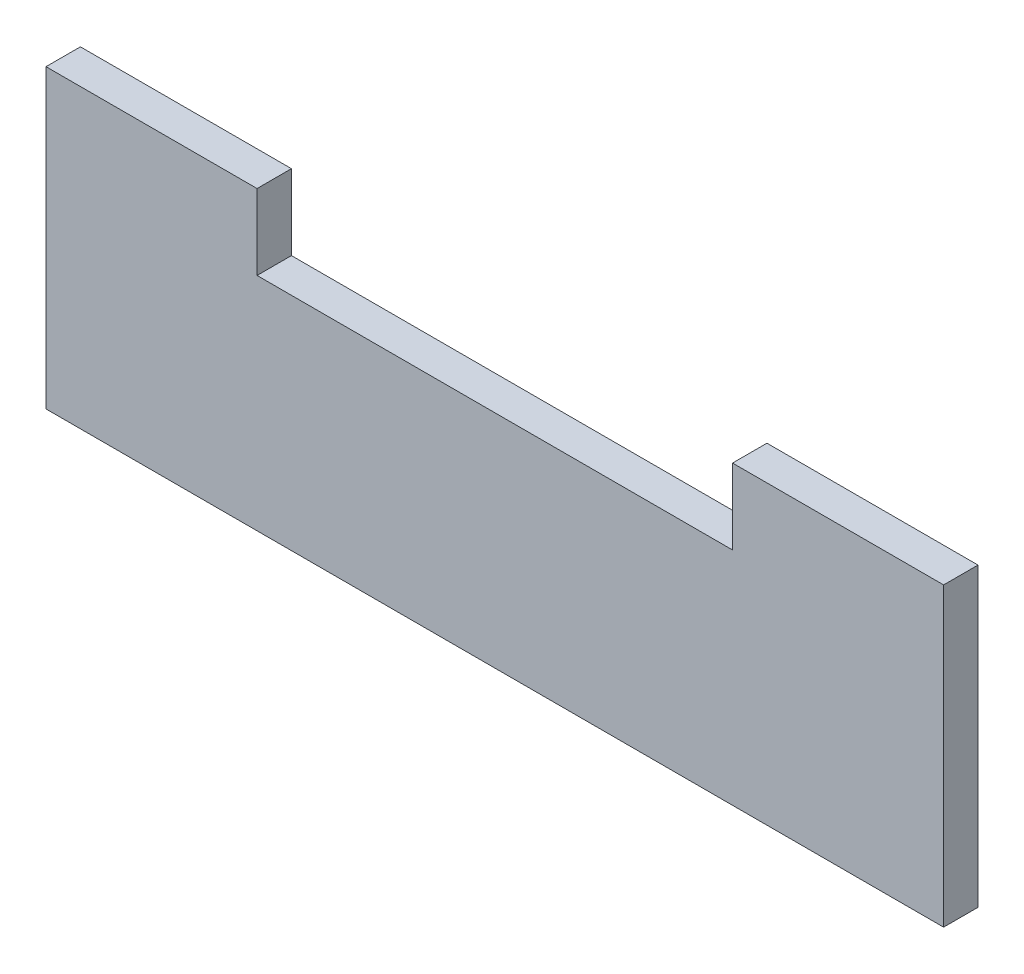
ISO-10303-21;
HEADER;
FILE_DESCRIPTION(('STEP AP214'),'2;1');
FILE_NAME('part.step','',(''),(''),'','','');
FILE_SCHEMA(('AUTOMOTIVE_DESIGN { 1 0 10303 214 1 1 1 1 }'));
ENDSEC;
DATA;
#1=APPLICATION_CONTEXT('core data for automotive mechanical design processes');
#2=APPLICATION_PROTOCOL_DEFINITION('international standard','automotive_design',2000,#1);
#3=PRODUCT_CONTEXT('',#1,'mechanical');
#4=PRODUCT('Part','Part','',(#3));
#5=PRODUCT_RELATED_PRODUCT_CATEGORY('part','',(#4));
#6=PRODUCT_DEFINITION_FORMATION('','',#4);
#7=PRODUCT_DEFINITION_CONTEXT('part definition',#1,'design');
#8=PRODUCT_DEFINITION('design','',#6,#7);
#9=PRODUCT_DEFINITION_SHAPE('','',#8);
#10=(LENGTH_UNIT() NAMED_UNIT(*) SI_UNIT(.MILLI.,.METRE.));
#11=(NAMED_UNIT(*) PLANE_ANGLE_UNIT() SI_UNIT($,.RADIAN.));
#12=(NAMED_UNIT(*) SI_UNIT($,.STERADIAN.) SOLID_ANGLE_UNIT());
#13=UNCERTAINTY_MEASURE_WITH_UNIT(LENGTH_MEASURE(1.E-05),#10,'distance_accuracy_value','');
#14=(GEOMETRIC_REPRESENTATION_CONTEXT(3) GLOBAL_UNCERTAINTY_ASSIGNED_CONTEXT((#13)) GLOBAL_UNIT_ASSIGNED_CONTEXT((#10,
#11,#12)) REPRESENTATION_CONTEXT('',''));
#15=CARTESIAN_POINT('',(0.,0.,0.));
#16=DIRECTION('',(0.,0.,1.));
#17=DIRECTION('',(1.,0.,0.));
#18=AXIS2_PLACEMENT_3D('',#15,#16,#17);
#19=CARTESIAN_POINT('',(-37.85,25.,2.9));
#20=DIRECTION('',(1.,0.,0.));
#21=DIRECTION('',(0.,0.,-1.));
#22=AXIS2_PLACEMENT_3D('',#19,#20,#21);
#23=PLANE('',#22);
#24=DIRECTION('',(0.,-1.,0.));
#25=VECTOR('',#24,1.);
#26=CARTESIAN_POINT('',(-37.85,25.,0.));
#27=LINE('',#26,#25);
#28=CARTESIAN_POINT('',(-37.85,25.,0.));
#29=VERTEX_POINT('',#28);
#30=CARTESIAN_POINT('',(-37.85,0.,0.));
#31=VERTEX_POINT('',#30);
#32=EDGE_CURVE('E140',#29,#31,#27,.T.);
#33=ORIENTED_EDGE('',*,*,#32,.T.);
#34=DIRECTION('',(0.,0.,-1.));
#35=VECTOR('',#34,1.);
#36=CARTESIAN_POINT('',(-37.85,0.,2.9));
#37=LINE('',#36,#35);
#38=CARTESIAN_POINT('',(-37.85,0.,2.9));
#39=VERTEX_POINT('',#38);
#40=EDGE_CURVE('E11',#39,#31,#37,.T.);
#41=ORIENTED_EDGE('',*,*,#40,.F.);
#42=DIRECTION('',(0.,-1.,0.));
#43=VECTOR('',#42,1.);
#44=CARTESIAN_POINT('',(-37.85,25.,2.9));
#45=LINE('',#44,#43);
#46=CARTESIAN_POINT('',(-37.85,25.,2.9));
#47=VERTEX_POINT('',#46);
#48=EDGE_CURVE('E162',#47,#39,#45,.T.);
#49=ORIENTED_EDGE('',*,*,#48,.F.);
#50=DIRECTION('',(0.,0.,-1.));
#51=VECTOR('',#50,1.);
#52=CARTESIAN_POINT('',(-37.85,25.,2.9));
#53=LINE('',#52,#51);
#54=EDGE_CURVE('E136',#47,#29,#53,.T.);
#55=ORIENTED_EDGE('',*,*,#54,.T.);
#56=EDGE_LOOP('',(#33,#41,#49,#55));
#57=FACE_BOUND('',#56,.T.);
#58=ADVANCED_FACE('F39',(#57),#23,.F.);
#59=CARTESIAN_POINT('',(-37.85,0.,2.9));
#60=DIRECTION('',(0.,1.,0.));
#61=DIRECTION('',(0.,0.,1.));
#62=AXIS2_PLACEMENT_3D('',#59,#60,#61);
#63=PLANE('',#62);
#64=DIRECTION('',(1.,0.,0.));
#65=VECTOR('',#64,1.);
#66=CARTESIAN_POINT('',(-37.85,0.,0.));
#67=LINE('',#66,#65);
#68=CARTESIAN_POINT('',(37.85,0.,0.));
#69=VERTEX_POINT('',#68);
#70=EDGE_CURVE('E144',#31,#69,#67,.T.);
#71=ORIENTED_EDGE('',*,*,#70,.T.);
#72=DIRECTION('',(0.,0.,-1.));
#73=VECTOR('',#72,1.);
#74=CARTESIAN_POINT('',(37.85,0.,2.9));
#75=LINE('',#74,#73);
#76=CARTESIAN_POINT('',(37.85,0.,2.9));
#77=VERTEX_POINT('',#76);
#78=EDGE_CURVE('E48',#77,#69,#75,.T.);
#79=ORIENTED_EDGE('',*,*,#78,.F.);
#80=DIRECTION('',(1.,0.,0.));
#81=VECTOR('',#80,1.);
#82=CARTESIAN_POINT('',(-37.85,0.,2.9));
#83=LINE('',#82,#81);
#84=EDGE_CURVE('E99',#39,#77,#83,.T.);
#85=ORIENTED_EDGE('',*,*,#84,.F.);
#86=ORIENTED_EDGE('',*,*,#40,.T.);
#87=EDGE_LOOP('',(#71,#79,#85,#86));
#88=FACE_BOUND('',#87,.T.);
#89=ADVANCED_FACE('F208',(#88),#63,.F.);
#90=CARTESIAN_POINT('',(37.85,0.,2.9));
#91=DIRECTION('',(-1.,0.,0.));
#92=DIRECTION('',(0.,0.,1.));
#93=AXIS2_PLACEMENT_3D('',#90,#91,#92);
#94=PLANE('',#93);
#95=DIRECTION('',(0.,1.,0.));
#96=VECTOR('',#95,1.);
#97=CARTESIAN_POINT('',(37.85,0.,0.));
#98=LINE('',#97,#96);
#99=CARTESIAN_POINT('',(37.85,25.,0.));
#100=VERTEX_POINT('',#99);
#101=EDGE_CURVE('E147',#69,#100,#98,.T.);
#102=ORIENTED_EDGE('',*,*,#101,.T.);
#103=DIRECTION('',(0.,0.,-1.));
#104=VECTOR('',#103,1.);
#105=CARTESIAN_POINT('',(37.85,25.,2.9));
#106=LINE('',#105,#104);
#107=CARTESIAN_POINT('',(37.85,25.,2.9));
#108=VERTEX_POINT('',#107);
#109=EDGE_CURVE('E173',#108,#100,#106,.T.);
#110=ORIENTED_EDGE('',*,*,#109,.F.);
#111=DIRECTION('',(0.,1.,0.));
#112=VECTOR('',#111,1.);
#113=CARTESIAN_POINT('',(37.85,0.,2.9));
#114=LINE('',#113,#112);
#115=EDGE_CURVE('E183',#77,#108,#114,.T.);
#116=ORIENTED_EDGE('',*,*,#115,.F.);
#117=ORIENTED_EDGE('',*,*,#78,.T.);
#118=EDGE_LOOP('',(#102,#110,#116,#117));
#119=FACE_BOUND('',#118,.T.);
#120=ADVANCED_FACE('F181',(#119),#94,.F.);
#121=CARTESIAN_POINT('',(37.85,25.,2.9));
#122=DIRECTION('',(0.,-1.,0.));
#123=DIRECTION('',(1.,0.,0.));
#124=AXIS2_PLACEMENT_3D('',#121,#122,#123);
#125=PLANE('',#124);
#126=DIRECTION('',(-1.,0.,0.));
#127=VECTOR('',#126,1.);
#128=CARTESIAN_POINT('',(37.85,25.,0.));
#129=LINE('',#128,#127);
#130=CARTESIAN_POINT('',(20.05,25.,0.));
#131=VERTEX_POINT('',#130);
#132=EDGE_CURVE('E150',#100,#131,#129,.T.);
#133=ORIENTED_EDGE('',*,*,#132,.T.);
#134=DIRECTION('',(0.,0.,-1.));
#135=VECTOR('',#134,1.);
#136=CARTESIAN_POINT('',(20.05,25.,2.9));
#137=LINE('',#136,#135);
#138=CARTESIAN_POINT('',(20.05,25.,2.9));
#139=VERTEX_POINT('',#138);
#140=EDGE_CURVE('E169',#139,#131,#137,.T.);
#141=ORIENTED_EDGE('',*,*,#140,.F.);
#142=DIRECTION('',(-1.,0.,0.));
#143=VECTOR('',#142,1.);
#144=CARTESIAN_POINT('',(37.85,25.,2.9));
#145=LINE('',#144,#143);
#146=EDGE_CURVE('E196',#108,#139,#145,.T.);
#147=ORIENTED_EDGE('',*,*,#146,.F.);
#148=ORIENTED_EDGE('',*,*,#109,.T.);
#149=EDGE_LOOP('',(#133,#141,#147,#148));
#150=FACE_BOUND('',#149,.T.);
#151=ADVANCED_FACE('F191',(#150),#125,.F.);
#152=CARTESIAN_POINT('',(20.05,25.,2.9));
#153=DIRECTION('',(1.,0.,0.));
#154=DIRECTION('',(0.,1.,0.));
#155=AXIS2_PLACEMENT_3D('',#152,#153,#154);
#156=PLANE('',#155);
#157=DIRECTION('',(0.,-1.,0.));
#158=VECTOR('',#157,1.);
#159=CARTESIAN_POINT('',(20.05,25.,0.));
#160=LINE('',#159,#158);
#161=CARTESIAN_POINT('',(20.05,18.65,0.));
#162=VERTEX_POINT('',#161);
#163=EDGE_CURVE('E153',#131,#162,#160,.T.);
#164=ORIENTED_EDGE('',*,*,#163,.T.);
#165=DIRECTION('',(0.,0.,-1.));
#166=VECTOR('',#165,1.);
#167=CARTESIAN_POINT('',(20.05,18.65,2.9));
#168=LINE('',#167,#166);
#169=CARTESIAN_POINT('',(20.05,18.65,2.9));
#170=VERTEX_POINT('',#169);
#171=EDGE_CURVE('E129',#170,#162,#168,.T.);
#172=ORIENTED_EDGE('',*,*,#171,.F.);
#173=DIRECTION('',(0.,-1.,0.));
#174=VECTOR('',#173,1.);
#175=CARTESIAN_POINT('',(20.05,25.,2.9));
#176=LINE('',#175,#174);
#177=EDGE_CURVE('E118',#139,#170,#176,.T.);
#178=ORIENTED_EDGE('',*,*,#177,.F.);
#179=ORIENTED_EDGE('',*,*,#140,.T.);
#180=EDGE_LOOP('',(#164,#172,#178,#179));
#181=FACE_BOUND('',#180,.T.);
#182=ADVANCED_FACE('F194',(#181),#156,.F.);
#183=CARTESIAN_POINT('',(20.05,18.65,2.9));
#184=DIRECTION('',(0.,-1.,0.));
#185=DIRECTION('',(1.,0.,0.));
#186=AXIS2_PLACEMENT_3D('',#183,#184,#185);
#187=PLANE('',#186);
#188=DIRECTION('',(-1.,0.,0.));
#189=VECTOR('',#188,1.);
#190=CARTESIAN_POINT('',(20.05,18.65,0.));
#191=LINE('',#190,#189);
#192=CARTESIAN_POINT('',(-20.05,18.65,0.));
#193=VERTEX_POINT('',#192);
#194=EDGE_CURVE('E127',#162,#193,#191,.T.);
#195=ORIENTED_EDGE('',*,*,#194,.T.);
#196=DIRECTION('',(0.,0.,-1.));
#197=VECTOR('',#196,1.);
#198=CARTESIAN_POINT('',(-20.05,18.65,2.9));
#199=LINE('',#198,#197);
#200=CARTESIAN_POINT('',(-20.05,18.65,2.9));
#201=VERTEX_POINT('',#200);
#202=EDGE_CURVE('E124',#201,#193,#199,.T.);
#203=ORIENTED_EDGE('',*,*,#202,.F.);
#204=DIRECTION('',(-1.,0.,0.));
#205=VECTOR('',#204,1.);
#206=CARTESIAN_POINT('',(20.05,18.65,2.9));
#207=LINE('',#206,#205);
#208=EDGE_CURVE('E112',#170,#201,#207,.T.);
#209=ORIENTED_EDGE('',*,*,#208,.F.);
#210=ORIENTED_EDGE('',*,*,#171,.T.);
#211=EDGE_LOOP('',(#195,#203,#209,#210));
#212=FACE_BOUND('',#211,.T.);
#213=ADVANCED_FACE('F125',(#212),#187,.F.);
#214=CARTESIAN_POINT('',(-20.05,18.65,2.9));
#215=DIRECTION('',(-1.,0.,0.));
#216=DIRECTION('',(0.,0.,1.));
#217=AXIS2_PLACEMENT_3D('',#214,#215,#216);
#218=PLANE('',#217);
#219=DIRECTION('',(0.,1.,0.));
#220=VECTOR('',#219,1.);
#221=CARTESIAN_POINT('',(-20.05,18.65,0.));
#222=LINE('',#221,#220);
#223=CARTESIAN_POINT('',(-20.05,25.,0.));
#224=VERTEX_POINT('',#223);
#225=EDGE_CURVE('E85',#193,#224,#222,.T.);
#226=ORIENTED_EDGE('',*,*,#225,.T.);
#227=DIRECTION('',(0.,0.,-1.));
#228=VECTOR('',#227,1.);
#229=CARTESIAN_POINT('',(-20.05,25.,2.9));
#230=LINE('',#229,#228);
#231=CARTESIAN_POINT('',(-20.05,25.,2.9));
#232=VERTEX_POINT('',#231);
#233=EDGE_CURVE('E130',#232,#224,#230,.T.);
#234=ORIENTED_EDGE('',*,*,#233,.F.);
#235=DIRECTION('',(0.,1.,0.));
#236=VECTOR('',#235,1.);
#237=CARTESIAN_POINT('',(-20.05,18.65,2.9));
#238=LINE('',#237,#236);
#239=EDGE_CURVE('E116',#201,#232,#238,.T.);
#240=ORIENTED_EDGE('',*,*,#239,.F.);
#241=ORIENTED_EDGE('',*,*,#202,.T.);
#242=EDGE_LOOP('',(#226,#234,#240,#241));
#243=FACE_BOUND('',#242,.T.);
#244=ADVANCED_FACE('F132',(#243),#218,.F.);
#245=CARTESIAN_POINT('',(-20.05,25.,2.9));
#246=DIRECTION('',(0.,-1.,0.));
#247=DIRECTION('',(1.,0.,0.));
#248=AXIS2_PLACEMENT_3D('',#245,#246,#247);
#249=PLANE('',#248);
#250=DIRECTION('',(-1.,0.,0.));
#251=VECTOR('',#250,1.);
#252=CARTESIAN_POINT('',(-20.05,25.,0.));
#253=LINE('',#252,#251);
#254=EDGE_CURVE('E91',#224,#29,#253,.T.);
#255=ORIENTED_EDGE('',*,*,#254,.T.);
#256=ORIENTED_EDGE('',*,*,#54,.F.);
#257=DIRECTION('',(-1.,0.,0.));
#258=VECTOR('',#257,1.);
#259=CARTESIAN_POINT('',(-20.05,25.,2.9));
#260=LINE('',#259,#258);
#261=EDGE_CURVE('E56',#232,#47,#260,.T.);
#262=ORIENTED_EDGE('',*,*,#261,.F.);
#263=ORIENTED_EDGE('',*,*,#233,.T.);
#264=EDGE_LOOP('',(#255,#256,#262,#263));
#265=FACE_BOUND('',#264,.T.);
#266=ADVANCED_FACE('F224',(#265),#249,.F.);
#267=CARTESIAN_POINT('',(0.,0.,2.9));
#268=DIRECTION('',(0.,0.,1.));
#269=DIRECTION('',(1.,0.,0.));
#270=AXIS2_PLACEMENT_3D('',#267,#268,#269);
#271=PLANE('',#270);
#272=ORIENTED_EDGE('',*,*,#48,.T.);
#273=ORIENTED_EDGE('',*,*,#84,.T.);
#274=ORIENTED_EDGE('',*,*,#115,.T.);
#275=ORIENTED_EDGE('',*,*,#146,.T.);
#276=ORIENTED_EDGE('',*,*,#177,.T.);
#277=ORIENTED_EDGE('',*,*,#208,.T.);
#278=ORIENTED_EDGE('',*,*,#239,.T.);
#279=ORIENTED_EDGE('',*,*,#261,.T.);
#280=EDGE_LOOP('',(#272,#273,#274,#275,#276,#277,#278,#279));
#281=FACE_BOUND('',#280,.T.);
#282=ADVANCED_FACE('F114',(#281),#271,.T.);
#283=CARTESIAN_POINT('',(0.,0.,0.));
#284=DIRECTION('',(0.,0.,1.));
#285=DIRECTION('',(1.,0.,0.));
#286=AXIS2_PLACEMENT_3D('',#283,#284,#285);
#287=PLANE('',#286);
#288=ORIENTED_EDGE('',*,*,#32,.F.);
#289=ORIENTED_EDGE('',*,*,#254,.F.);
#290=ORIENTED_EDGE('',*,*,#225,.F.);
#291=ORIENTED_EDGE('',*,*,#194,.F.);
#292=ORIENTED_EDGE('',*,*,#163,.F.);
#293=ORIENTED_EDGE('',*,*,#132,.F.);
#294=ORIENTED_EDGE('',*,*,#101,.F.);
#295=ORIENTED_EDGE('',*,*,#70,.F.);
#296=EDGE_LOOP('',(#288,#289,#290,#291,#292,#293,#294,#295));
#297=FACE_BOUND('',#296,.T.);
#298=ADVANCED_FACE('F187',(#297),#287,.F.);
#299=CLOSED_SHELL('',(#58,#89,#120,#151,#182,#213,#244,#266,#282,#298));
#300=MANIFOLD_SOLID_BREP('B2',#299);
#301=ADVANCED_BREP_SHAPE_REPRESENTATION('',(#18,#300),#14);
#302=SHAPE_DEFINITION_REPRESENTATION(#9,#301);
ENDSEC;
END-ISO-10303-21;
